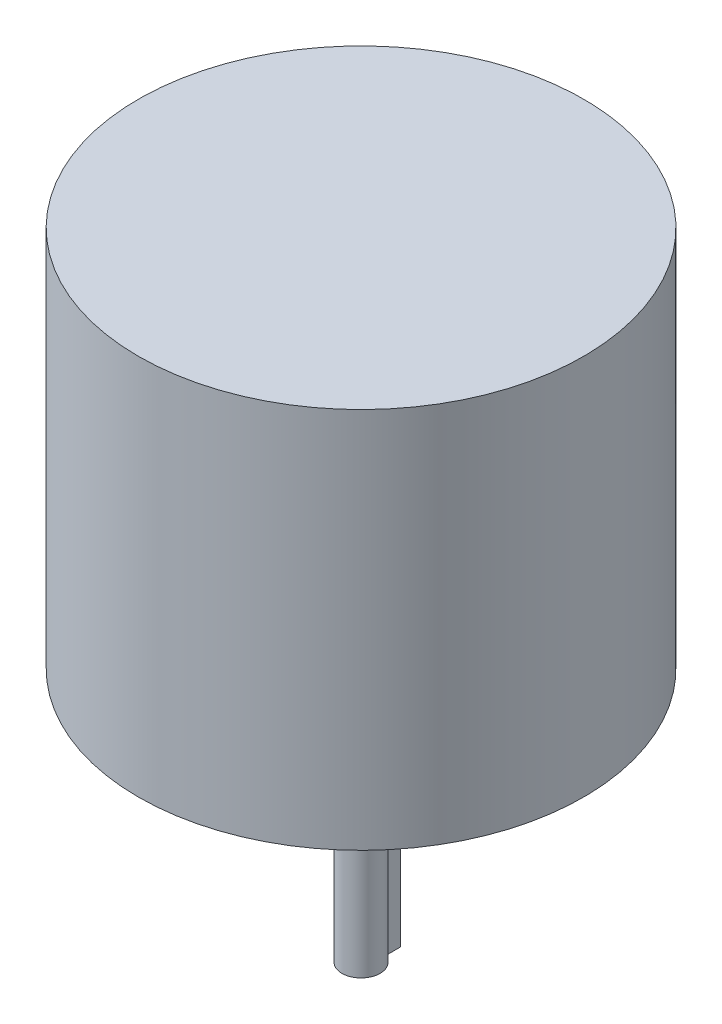
ISO-10303-21;
HEADER;
FILE_DESCRIPTION(('STEP AP214'),'2;1');
FILE_NAME('part.step','',(''),(''),'','','');
FILE_SCHEMA(('AUTOMOTIVE_DESIGN { 1 0 10303 214 1 1 1 1 }'));
ENDSEC;
DATA;
#1=APPLICATION_CONTEXT('core data for automotive mechanical design processes');
#2=APPLICATION_PROTOCOL_DEFINITION('international standard','automotive_design',2000,#1);
#3=PRODUCT_CONTEXT('',#1,'mechanical');
#4=PRODUCT('Part','Part','',(#3));
#5=PRODUCT_RELATED_PRODUCT_CATEGORY('part','',(#4));
#6=PRODUCT_DEFINITION_FORMATION('','',#4);
#7=PRODUCT_DEFINITION_CONTEXT('part definition',#1,'design');
#8=PRODUCT_DEFINITION('design','',#6,#7);
#9=PRODUCT_DEFINITION_SHAPE('','',#8);
#10=(LENGTH_UNIT() NAMED_UNIT(*) SI_UNIT(.MILLI.,.METRE.));
#11=(NAMED_UNIT(*) PLANE_ANGLE_UNIT() SI_UNIT($,.RADIAN.));
#12=(NAMED_UNIT(*) SI_UNIT($,.STERADIAN.) SOLID_ANGLE_UNIT());
#13=UNCERTAINTY_MEASURE_WITH_UNIT(LENGTH_MEASURE(1.E-05),#10,'distance_accuracy_value','');
#14=(GEOMETRIC_REPRESENTATION_CONTEXT(3) GLOBAL_UNCERTAINTY_ASSIGNED_CONTEXT((#13)) GLOBAL_UNIT_ASSIGNED_CONTEXT((#10,
#11,#12)) REPRESENTATION_CONTEXT('',''));
#15=CARTESIAN_POINT('',(0.,0.,0.));
#16=DIRECTION('',(0.,0.,1.));
#17=DIRECTION('',(1.,0.,0.));
#18=AXIS2_PLACEMENT_3D('',#15,#16,#17);
#19=CARTESIAN_POINT('',(0.,0.,0.));
#20=DIRECTION('',(0.,1.,0.));
#21=DIRECTION('',(0.,0.,1.));
#22=AXIS2_PLACEMENT_3D('',#19,#20,#21);
#23=PLANE('',#22);
#24=CARTESIAN_POINT('',(0.,0.,0.));
#25=DIRECTION('',(0.,1.,0.));
#26=DIRECTION('',(0.,0.,1.));
#27=AXIS2_PLACEMENT_3D('',#24,#25,#26);
#28=CIRCLE('',#27,17.5);
#29=CARTESIAN_POINT('',(0.,0.,17.5));
#30=VERTEX_POINT('',#29);
#31=EDGE_CURVE('E164',#30,#30,#28,.T.);
#32=ORIENTED_EDGE('',*,*,#31,.F.);
#33=EDGE_LOOP('',(#32));
#34=FACE_BOUND('',#33,.T.);
#35=CARTESIAN_POINT('',(0.,0.,0.));
#36=DIRECTION('',(0.,-1.,0.));
#37=DIRECTION('',(0.,0.,-1.));
#38=AXIS2_PLACEMENT_3D('',#35,#36,#37);
#39=CIRCLE('',#38,1.5);
#40=CARTESIAN_POINT('',(0.5,0.,-1.4142135623731));
#41=VERTEX_POINT('',#40);
#42=CARTESIAN_POINT('',(-0.5,0.,-1.4142135623731));
#43=VERTEX_POINT('',#42);
#44=EDGE_CURVE('E136',#41,#43,#39,.T.);
#45=ORIENTED_EDGE('',*,*,#44,.F.);
#46=DIRECTION('',(0.,0.,-1.));
#47=VECTOR('',#46,1.);
#48=CARTESIAN_POINT('',(0.5,0.,0.));
#49=LINE('',#48,#47);
#50=CARTESIAN_POINT('',(0.5,0.,-2.6));
#51=VERTEX_POINT('',#50);
#52=EDGE_CURVE('E132',#41,#51,#49,.T.);
#53=ORIENTED_EDGE('',*,*,#52,.T.);
#54=DIRECTION('',(1.,0.,0.));
#55=VECTOR('',#54,1.);
#56=CARTESIAN_POINT('',(0.,0.,-2.6));
#57=LINE('',#56,#55);
#58=CARTESIAN_POINT('',(-0.5,0.,-2.6));
#59=VERTEX_POINT('',#58);
#60=EDGE_CURVE('E61',#59,#51,#57,.T.);
#61=ORIENTED_EDGE('',*,*,#60,.F.);
#62=DIRECTION('',(0.,0.,-1.));
#63=VECTOR('',#62,1.);
#64=CARTESIAN_POINT('',(-0.5,0.,0.));
#65=LINE('',#64,#63);
#66=EDGE_CURVE('E356',#43,#59,#65,.T.);
#67=ORIENTED_EDGE('',*,*,#66,.F.);
#68=EDGE_LOOP('',(#45,#53,#61,#67));
#69=FACE_BOUND('',#68,.T.);
#70=ADVANCED_FACE('F45',(#34,#69),#23,.F.);
#71=CARTESIAN_POINT('',(0.,30.,0.));
#72=DIRECTION('',(0.,-1.,0.));
#73=DIRECTION('',(0.,0.,-1.));
#74=AXIS2_PLACEMENT_3D('',#71,#72,#73);
#75=CYLINDRICAL_SURFACE('',#74,17.5);
#76=DIRECTION('',(0.,-1.,0.));
#77=VECTOR('',#76,1.);
#78=CARTESIAN_POINT('',(-13.4631942717915,30.,11.18));
#79=LINE('',#78,#77);
#80=CARTESIAN_POINT('',(-13.4631942717915,26.,11.18));
#81=VERTEX_POINT('',#80);
#82=CARTESIAN_POINT('',(-13.4631942717915,4.,11.18));
#83=VERTEX_POINT('',#82);
#84=EDGE_CURVE('E54',#81,#83,#79,.T.);
#85=ORIENTED_EDGE('',*,*,#84,.T.);
#86=CARTESIAN_POINT('',(0.,4.,0.));
#87=DIRECTION('',(0.,-1.,0.));
#88=DIRECTION('',(0.,0.,-1.));
#89=AXIS2_PLACEMENT_3D('',#86,#87,#88);
#90=CIRCLE('',#89,17.5);
#91=CARTESIAN_POINT('',(-13.4631942717915,4.,-11.18));
#92=VERTEX_POINT('',#91);
#93=EDGE_CURVE('E11',#83,#92,#90,.T.);
#94=ORIENTED_EDGE('',*,*,#93,.T.);
#95=DIRECTION('',(0.,-1.,0.));
#96=VECTOR('',#95,1.);
#97=CARTESIAN_POINT('',(-13.4631942717915,30.,-11.18));
#98=LINE('',#97,#96);
#99=CARTESIAN_POINT('',(-13.4631942717915,26.,-11.18));
#100=VERTEX_POINT('',#99);
#101=EDGE_CURVE('E176',#92,#100,#98,.F.);
#102=ORIENTED_EDGE('',*,*,#101,.T.);
#103=CARTESIAN_POINT('',(0.,26.,0.));
#104=DIRECTION('',(0.,-1.,0.));
#105=DIRECTION('',(0.,0.,-1.));
#106=AXIS2_PLACEMENT_3D('',#103,#104,#105);
#107=CIRCLE('',#106,17.5);
#108=EDGE_CURVE('E183',#81,#100,#107,.T.);
#109=ORIENTED_EDGE('',*,*,#108,.F.);
#110=EDGE_LOOP('',(#85,#94,#102,#109));
#111=FACE_BOUND('',#110,.T.);
#112=CARTESIAN_POINT('',(0.,30.,0.));
#113=DIRECTION('',(0.,1.,0.));
#114=DIRECTION('',(0.,0.,1.));
#115=AXIS2_PLACEMENT_3D('',#112,#113,#114);
#116=CIRCLE('',#115,17.5);
#117=CARTESIAN_POINT('',(0.,30.,17.5));
#118=VERTEX_POINT('',#117);
#119=EDGE_CURVE('E172',#118,#118,#116,.T.);
#120=ORIENTED_EDGE('',*,*,#119,.F.);
#121=EDGE_LOOP('',(#120));
#122=FACE_BOUND('',#121,.T.);
#123=ORIENTED_EDGE('',*,*,#31,.T.);
#124=EDGE_LOOP('',(#123));
#125=FACE_BOUND('',#124,.T.);
#126=ADVANCED_FACE('F47',(#111,#122,#125),#75,.T.);
#127=CARTESIAN_POINT('',(0.,30.,0.));
#128=DIRECTION('',(0.,1.,0.));
#129=DIRECTION('',(0.,0.,1.));
#130=AXIS2_PLACEMENT_3D('',#127,#128,#129);
#131=PLANE('',#130);
#132=ORIENTED_EDGE('',*,*,#119,.T.);
#133=EDGE_LOOP('',(#132));
#134=FACE_BOUND('',#133,.T.);
#135=ADVANCED_FACE('F220',(#134),#131,.T.);
#136=CARTESIAN_POINT('',(-30.,4.,0.));
#137=DIRECTION('',(0.,-1.,0.));
#138=DIRECTION('',(0.,0.,-1.));
#139=AXIS2_PLACEMENT_3D('',#136,#137,#138);
#140=PLANE('',#139);
#141=DIRECTION('',(1.,0.,0.));
#142=VECTOR('',#141,1.);
#143=CARTESIAN_POINT('',(-30.,4.,11.18));
#144=LINE('',#143,#142);
#145=CARTESIAN_POINT('',(0.,4.,11.18));
#146=VERTEX_POINT('',#145);
#147=EDGE_CURVE('E161',#83,#146,#144,.T.);
#148=ORIENTED_EDGE('',*,*,#147,.T.);
#149=DIRECTION('',(0.,0.,-1.));
#150=VECTOR('',#149,1.);
#151=CARTESIAN_POINT('',(0.,4.,0.));
#152=LINE('',#151,#150);
#153=CARTESIAN_POINT('',(0.,4.,-11.18));
#154=VERTEX_POINT('',#153);
#155=EDGE_CURVE('E139',#146,#154,#152,.T.);
#156=ORIENTED_EDGE('',*,*,#155,.T.);
#157=DIRECTION('',(1.,0.,0.));
#158=VECTOR('',#157,1.);
#159=CARTESIAN_POINT('',(-30.,4.,-11.18));
#160=LINE('',#159,#158);
#161=EDGE_CURVE('E160',#92,#154,#160,.T.);
#162=ORIENTED_EDGE('',*,*,#161,.F.);
#163=ORIENTED_EDGE('',*,*,#93,.F.);
#164=EDGE_LOOP('',(#148,#156,#162,#163));
#165=FACE_BOUND('',#164,.T.);
#166=ADVANCED_FACE('F204',(#165),#140,.F.);
#167=CARTESIAN_POINT('',(-30.,0.,11.18));
#168=DIRECTION('',(0.,0.,1.));
#169=DIRECTION('',(0.,-1.,0.));
#170=AXIS2_PLACEMENT_3D('',#167,#168,#169);
#171=PLANE('',#170);
#172=DIRECTION('',(1.,0.,0.));
#173=VECTOR('',#172,1.);
#174=CARTESIAN_POINT('',(-30.,26.,11.18));
#175=LINE('',#174,#173);
#176=CARTESIAN_POINT('',(0.,26.,11.18));
#177=VERTEX_POINT('',#176);
#178=EDGE_CURVE('E165',#81,#177,#175,.T.);
#179=ORIENTED_EDGE('',*,*,#178,.T.);
#180=DIRECTION('',(0.,-1.,0.));
#181=VECTOR('',#180,1.);
#182=CARTESIAN_POINT('',(0.,0.,11.18));
#183=LINE('',#182,#181);
#184=EDGE_CURVE('E156',#177,#146,#183,.T.);
#185=ORIENTED_EDGE('',*,*,#184,.T.);
#186=ORIENTED_EDGE('',*,*,#147,.F.);
#187=ORIENTED_EDGE('',*,*,#84,.F.);
#188=EDGE_LOOP('',(#179,#185,#186,#187));
#189=FACE_BOUND('',#188,.T.);
#190=ADVANCED_FACE('F193',(#189),#171,.F.);
#191=CARTESIAN_POINT('',(-30.,26.,0.));
#192=DIRECTION('',(0.,-1.,0.));
#193=DIRECTION('',(0.,0.,-1.));
#194=AXIS2_PLACEMENT_3D('',#191,#192,#193);
#195=PLANE('',#194);
#196=ORIENTED_EDGE('',*,*,#108,.T.);
#197=DIRECTION('',(1.,0.,0.));
#198=VECTOR('',#197,1.);
#199=CARTESIAN_POINT('',(-30.,26.,-11.18));
#200=LINE('',#199,#198);
#201=CARTESIAN_POINT('',(0.,26.,-11.18));
#202=VERTEX_POINT('',#201);
#203=EDGE_CURVE('E69',#100,#202,#200,.T.);
#204=ORIENTED_EDGE('',*,*,#203,.T.);
#205=DIRECTION('',(0.,0.,-1.));
#206=VECTOR('',#205,1.);
#207=CARTESIAN_POINT('',(0.,26.,0.));
#208=LINE('',#207,#206);
#209=EDGE_CURVE('E152',#177,#202,#208,.T.);
#210=ORIENTED_EDGE('',*,*,#209,.F.);
#211=ORIENTED_EDGE('',*,*,#178,.F.);
#212=EDGE_LOOP('',(#196,#204,#210,#211));
#213=FACE_BOUND('',#212,.T.);
#214=ADVANCED_FACE('F196',(#213),#195,.T.);
#215=CARTESIAN_POINT('',(-30.,0.,-11.18));
#216=DIRECTION('',(0.,0.,-1.));
#217=DIRECTION('',(-1.,0.,0.));
#218=AXIS2_PLACEMENT_3D('',#215,#216,#217);
#219=PLANE('',#218);
#220=ORIENTED_EDGE('',*,*,#161,.T.);
#221=DIRECTION('',(0.,1.,0.));
#222=VECTOR('',#221,1.);
#223=CARTESIAN_POINT('',(0.,0.,-11.18));
#224=LINE('',#223,#222);
#225=EDGE_CURVE('E144',#154,#202,#224,.T.);
#226=ORIENTED_EDGE('',*,*,#225,.T.);
#227=ORIENTED_EDGE('',*,*,#203,.F.);
#228=ORIENTED_EDGE('',*,*,#101,.F.);
#229=EDGE_LOOP('',(#220,#226,#227,#228));
#230=FACE_BOUND('',#229,.T.);
#231=ADVANCED_FACE('F205',(#230),#219,.F.);
#232=CARTESIAN_POINT('',(0.,0.,0.));
#233=DIRECTION('',(1.,0.,0.));
#234=DIRECTION('',(0.,0.,-1.));
#235=AXIS2_PLACEMENT_3D('',#232,#233,#234);
#236=PLANE('',#235);
#237=ORIENTED_EDGE('',*,*,#155,.F.);
#238=ORIENTED_EDGE('',*,*,#184,.F.);
#239=ORIENTED_EDGE('',*,*,#209,.T.);
#240=ORIENTED_EDGE('',*,*,#225,.F.);
#241=EDGE_LOOP('',(#237,#238,#239,#240));
#242=FACE_BOUND('',#241,.T.);
#243=ADVANCED_FACE('F201',(#242),#236,.F.);
#244=CARTESIAN_POINT('',(0.,-20.,0.));
#245=DIRECTION('',(0.,1.,0.));
#246=DIRECTION('',(0.,0.,1.));
#247=AXIS2_PLACEMENT_3D('',#244,#245,#246);
#248=CYLINDRICAL_SURFACE('',#247,1.5);
#249=ORIENTED_EDGE('',*,*,#44,.T.);
#250=DIRECTION('',(0.,1.,0.));
#251=VECTOR('',#250,1.);
#252=CARTESIAN_POINT('',(-0.5,-20.,-1.4142135623731));
#253=LINE('',#252,#251);
#254=CARTESIAN_POINT('',(-0.5,-20.,-1.4142135623731));
#255=VERTEX_POINT('',#254);
#256=EDGE_CURVE('E116',#255,#43,#253,.T.);
#257=ORIENTED_EDGE('',*,*,#256,.F.);
#258=CARTESIAN_POINT('',(0.,-20.,0.));
#259=DIRECTION('',(0.,-1.,0.));
#260=DIRECTION('',(0.,0.,-1.));
#261=AXIS2_PLACEMENT_3D('',#258,#259,#260);
#262=CIRCLE('',#261,1.5);
#263=CARTESIAN_POINT('',(0.5,-20.,-1.4142135623731));
#264=VERTEX_POINT('',#263);
#265=EDGE_CURVE('E123',#264,#255,#262,.T.);
#266=ORIENTED_EDGE('',*,*,#265,.F.);
#267=DIRECTION('',(0.,1.,0.));
#268=VECTOR('',#267,1.);
#269=CARTESIAN_POINT('',(0.5,-20.,-1.4142135623731));
#270=LINE('',#269,#268);
#271=EDGE_CURVE('E353',#264,#41,#270,.T.);
#272=ORIENTED_EDGE('',*,*,#271,.T.);
#273=EDGE_LOOP('',(#249,#257,#266,#272));
#274=FACE_BOUND('',#273,.T.);
#275=ADVANCED_FACE('F134',(#274),#248,.T.);
#276=CARTESIAN_POINT('',(-0.5,-20.,0.));
#277=DIRECTION('',(1.,0.,0.));
#278=DIRECTION('',(0.,0.,-1.));
#279=AXIS2_PLACEMENT_3D('',#276,#277,#278);
#280=PLANE('',#279);
#281=ORIENTED_EDGE('',*,*,#66,.T.);
#282=DIRECTION('',(0.,1.,0.));
#283=VECTOR('',#282,1.);
#284=CARTESIAN_POINT('',(-0.5,-20.,-2.6));
#285=LINE('',#284,#283);
#286=CARTESIAN_POINT('',(-0.5,-20.,-2.6));
#287=VERTEX_POINT('',#286);
#288=EDGE_CURVE('E118',#287,#59,#285,.T.);
#289=ORIENTED_EDGE('',*,*,#288,.F.);
#290=DIRECTION('',(0.,0.,-1.));
#291=VECTOR('',#290,1.);
#292=CARTESIAN_POINT('',(-0.5,-20.,0.));
#293=LINE('',#292,#291);
#294=EDGE_CURVE('E112',#255,#287,#293,.T.);
#295=ORIENTED_EDGE('',*,*,#294,.F.);
#296=ORIENTED_EDGE('',*,*,#256,.T.);
#297=EDGE_LOOP('',(#281,#289,#295,#296));
#298=FACE_BOUND('',#297,.T.);
#299=ADVANCED_FACE('F114',(#298),#280,.F.);
#300=CARTESIAN_POINT('',(0.,-20.,-2.6));
#301=DIRECTION('',(0.,0.,1.));
#302=DIRECTION('',(1.,0.,0.));
#303=AXIS2_PLACEMENT_3D('',#300,#301,#302);
#304=PLANE('',#303);
#305=ORIENTED_EDGE('',*,*,#60,.T.);
#306=DIRECTION('',(0.,1.,0.));
#307=VECTOR('',#306,1.);
#308=CARTESIAN_POINT('',(0.5,-20.,-2.6));
#309=LINE('',#308,#307);
#310=CARTESIAN_POINT('',(0.5,-20.,-2.6));
#311=VERTEX_POINT('',#310);
#312=EDGE_CURVE('E146',#311,#51,#309,.T.);
#313=ORIENTED_EDGE('',*,*,#312,.F.);
#314=DIRECTION('',(1.,0.,0.));
#315=VECTOR('',#314,1.);
#316=CARTESIAN_POINT('',(0.,-20.,-2.6));
#317=LINE('',#316,#315);
#318=EDGE_CURVE('E122',#287,#311,#317,.T.);
#319=ORIENTED_EDGE('',*,*,#318,.F.);
#320=ORIENTED_EDGE('',*,*,#288,.T.);
#321=EDGE_LOOP('',(#305,#313,#319,#320));
#322=FACE_BOUND('',#321,.T.);
#323=ADVANCED_FACE('F238',(#322),#304,.F.);
#324=CARTESIAN_POINT('',(0.5,-20.,0.));
#325=DIRECTION('',(1.,0.,0.));
#326=DIRECTION('',(0.,0.,-1.));
#327=AXIS2_PLACEMENT_3D('',#324,#325,#326);
#328=PLANE('',#327);
#329=ORIENTED_EDGE('',*,*,#52,.F.);
#330=ORIENTED_EDGE('',*,*,#271,.F.);
#331=DIRECTION('',(0.,0.,-1.));
#332=VECTOR('',#331,1.);
#333=CARTESIAN_POINT('',(0.5,-20.,0.));
#334=LINE('',#333,#332);
#335=EDGE_CURVE('E129',#264,#311,#334,.T.);
#336=ORIENTED_EDGE('',*,*,#335,.T.);
#337=ORIENTED_EDGE('',*,*,#312,.T.);
#338=EDGE_LOOP('',(#329,#330,#336,#337));
#339=FACE_BOUND('',#338,.T.);
#340=ADVANCED_FACE('F241',(#339),#328,.T.);
#341=CARTESIAN_POINT('',(0.,-20.,0.));
#342=DIRECTION('',(0.,-1.,0.));
#343=DIRECTION('',(0.,0.,-1.));
#344=AXIS2_PLACEMENT_3D('',#341,#342,#343);
#345=PLANE('',#344);
#346=ORIENTED_EDGE('',*,*,#265,.T.);
#347=ORIENTED_EDGE('',*,*,#294,.T.);
#348=ORIENTED_EDGE('',*,*,#318,.T.);
#349=ORIENTED_EDGE('',*,*,#335,.F.);
#350=EDGE_LOOP('',(#346,#347,#348,#349));
#351=FACE_BOUND('',#350,.T.);
#352=ADVANCED_FACE('F127',(#351),#345,.T.);
#353=CLOSED_SHELL('',(#70,#126,#135,#166,#190,#214,#231,#243,#275,#299,#323,#340,#352));
#354=MANIFOLD_SOLID_BREP('B2',#353);
#355=ADVANCED_BREP_SHAPE_REPRESENTATION('',(#18,#354),#14);
#356=SHAPE_DEFINITION_REPRESENTATION(#9,#355);
ENDSEC;
END-ISO-10303-21;
